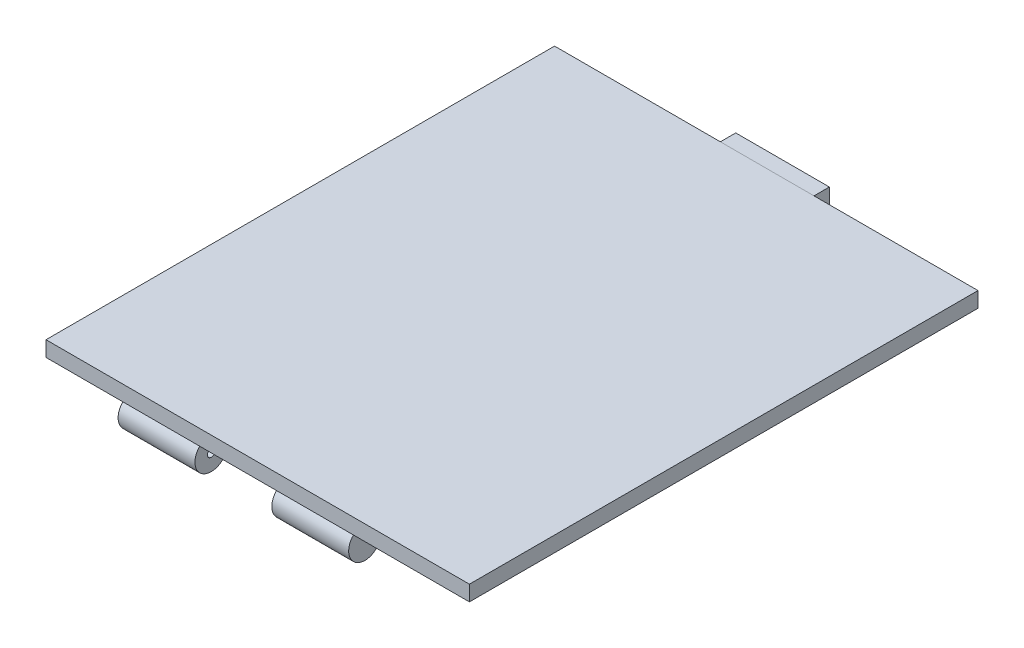
ISO-10303-21;
HEADER;
FILE_DESCRIPTION(('STEP AP214'),'2;1');
FILE_NAME('part.step','',(''),(''),'','','');
FILE_SCHEMA(('AUTOMOTIVE_DESIGN { 1 0 10303 214 1 1 1 1 }'));
ENDSEC;
DATA;
#1=APPLICATION_CONTEXT('core data for automotive mechanical design processes');
#2=APPLICATION_PROTOCOL_DEFINITION('international standard','automotive_design',2000,#1);
#3=PRODUCT_CONTEXT('',#1,'mechanical');
#4=PRODUCT('Part','Part','',(#3));
#5=PRODUCT_RELATED_PRODUCT_CATEGORY('part','',(#4));
#6=PRODUCT_DEFINITION_FORMATION('','',#4);
#7=PRODUCT_DEFINITION_CONTEXT('part definition',#1,'design');
#8=PRODUCT_DEFINITION('design','',#6,#7);
#9=PRODUCT_DEFINITION_SHAPE('','',#8);
#10=(LENGTH_UNIT() NAMED_UNIT(*) SI_UNIT(.MILLI.,.METRE.));
#11=(NAMED_UNIT(*) PLANE_ANGLE_UNIT() SI_UNIT($,.RADIAN.));
#12=(NAMED_UNIT(*) SI_UNIT($,.STERADIAN.) SOLID_ANGLE_UNIT());
#13=UNCERTAINTY_MEASURE_WITH_UNIT(LENGTH_MEASURE(1.E-05),#10,'distance_accuracy_value','');
#14=(GEOMETRIC_REPRESENTATION_CONTEXT(3) GLOBAL_UNCERTAINTY_ASSIGNED_CONTEXT((#13)) GLOBAL_UNIT_ASSIGNED_CONTEXT((#10,
#11,#12)) REPRESENTATION_CONTEXT('',''));
#15=CARTESIAN_POINT('',(0.,0.,0.));
#16=DIRECTION('',(0.,0.,1.));
#17=DIRECTION('',(1.,0.,0.));
#18=AXIS2_PLACEMENT_3D('',#15,#16,#17);
#19=CARTESIAN_POINT('',(0.,2.,-2.));
#20=DIRECTION('',(0.,-1.,0.));
#21=DIRECTION('',(0.,0.,-1.));
#22=AXIS2_PLACEMENT_3D('',#19,#20,#21);
#23=PLANE('',#22);
#24=DIRECTION('',(1.,0.,0.));
#25=VECTOR('',#24,1.);
#26=CARTESIAN_POINT('',(0.,2.,0.));
#27=LINE('',#26,#25);
#28=CARTESIAN_POINT('',(21.570158565403,2.,0.));
#29=VERTEX_POINT('',#28);
#30=CARTESIAN_POINT('',(33.7548871875866,2.,0.));
#31=VERTEX_POINT('',#30);
#32=EDGE_CURVE('E161',#29,#31,#27,.T.);
#33=ORIENTED_EDGE('',*,*,#32,.T.);
#34=DIRECTION('',(0.,0.,1.));
#35=VECTOR('',#34,1.);
#36=CARTESIAN_POINT('',(33.7548871875866,2.,-2.00000000000001));
#37=LINE('',#36,#35);
#38=CARTESIAN_POINT('',(33.7548871875866,2.,-2.00000000000001));
#39=VERTEX_POINT('',#38);
#40=EDGE_CURVE('E58',#39,#31,#37,.T.);
#41=ORIENTED_EDGE('',*,*,#40,.F.);
#42=DIRECTION('',(1.,0.,0.));
#43=VECTOR('',#42,1.);
#44=CARTESIAN_POINT('',(0.,2.,-2.));
#45=LINE('',#44,#43);
#46=CARTESIAN_POINT('',(21.570158565403,2.,-2.00000000000001));
#47=VERTEX_POINT('',#46);
#48=EDGE_CURVE('E140',#47,#39,#45,.T.);
#49=ORIENTED_EDGE('',*,*,#48,.F.);
#50=DIRECTION('',(0.,0.,1.));
#51=VECTOR('',#50,1.);
#52=CARTESIAN_POINT('',(21.570158565403,2.,-2.00000000000001));
#53=LINE('',#52,#51);
#54=EDGE_CURVE('E73',#47,#29,#53,.T.);
#55=ORIENTED_EDGE('',*,*,#54,.T.);
#56=EDGE_LOOP('',(#33,#41,#49,#55));
#57=FACE_BOUND('',#56,.T.);
#58=ADVANCED_FACE('F50',(#57),#23,.F.);
#59=CARTESIAN_POINT('',(33.7548871875866,0.,-2.00000000000001));
#60=DIRECTION('',(1.,0.,0.));
#61=DIRECTION('',(0.,0.,-1.));
#62=AXIS2_PLACEMENT_3D('',#59,#60,#61);
#63=PLANE('',#62);
#64=DIRECTION('',(0.,0.348047068519465,0.937477060036675));
#65=VECTOR('',#64,1.);
#66=CARTESIAN_POINT('',(33.7548871875866,-5.72819739649923,0.126646503408183));
#67=LINE('',#66,#65);
#68=CARTESIAN_POINT('',(33.7548871875866,-6.51773466929334,-2.00000000000001));
#69=VERTEX_POINT('',#68);
#70=CARTESIAN_POINT('',(33.7548871875866,-5.77521608754618,0.));
#71=VERTEX_POINT('',#70);
#72=EDGE_CURVE('E65',#69,#71,#67,.T.);
#73=ORIENTED_EDGE('',*,*,#72,.F.);
#74=DIRECTION('',(0.,1.,0.));
#75=VECTOR('',#74,1.);
#76=CARTESIAN_POINT('',(33.7548871875866,0.,-2.00000000000001));
#77=LINE('',#76,#75);
#78=EDGE_CURVE('E142',#69,#39,#77,.T.);
#79=ORIENTED_EDGE('',*,*,#78,.T.);
#80=ORIENTED_EDGE('',*,*,#40,.T.);
#81=DIRECTION('',(0.,1.,0.));
#82=VECTOR('',#81,1.);
#83=CARTESIAN_POINT('',(33.7548871875866,0.,0.));
#84=LINE('',#83,#82);
#85=EDGE_CURVE('E163',#71,#31,#84,.T.);
#86=ORIENTED_EDGE('',*,*,#85,.F.);
#87=EDGE_LOOP('',(#73,#79,#80,#86));
#88=FACE_BOUND('',#87,.T.);
#89=ADVANCED_FACE('F191',(#88),#63,.T.);
#90=CARTESIAN_POINT('',(32.5665912020275,0.,-2.00000000000001));
#91=DIRECTION('',(-1.,0.,0.));
#92=DIRECTION('',(0.,0.,1.));
#93=AXIS2_PLACEMENT_3D('',#90,#91,#92);
#94=PLANE('',#93);
#95=DIRECTION('',(0.,-1.,0.));
#96=VECTOR('',#95,1.);
#97=CARTESIAN_POINT('',(32.5665912020275,0.,0.));
#98=LINE('',#97,#96);
#99=CARTESIAN_POINT('',(32.5665912020275,-4.5,0.));
#100=VERTEX_POINT('',#99);
#101=CARTESIAN_POINT('',(32.5665912020275,-5.49325838084499,0.));
#102=VERTEX_POINT('',#101);
#103=EDGE_CURVE('E152',#100,#102,#98,.T.);
#104=ORIENTED_EDGE('',*,*,#103,.F.);
#105=DIRECTION('',(0.,0.,1.));
#106=VECTOR('',#105,1.);
#107=CARTESIAN_POINT('',(32.5665912020275,-4.5,-2.00000000000001));
#108=LINE('',#107,#106);
#109=CARTESIAN_POINT('',(32.5665912020275,-4.5,-2.00000000000001));
#110=VERTEX_POINT('',#109);
#111=EDGE_CURVE('E106',#110,#100,#108,.T.);
#112=ORIENTED_EDGE('',*,*,#111,.F.);
#113=DIRECTION('',(0.,-1.,0.));
#114=VECTOR('',#113,1.);
#115=CARTESIAN_POINT('',(32.5665912020275,0.,-2.00000000000001));
#116=LINE('',#115,#114);
#117=CARTESIAN_POINT('',(32.5665912020275,-5.49325838084499,-2.00000000000001));
#118=VERTEX_POINT('',#117);
#119=EDGE_CURVE('E130',#110,#118,#116,.T.);
#120=ORIENTED_EDGE('',*,*,#119,.T.);
#121=DIRECTION('',(0.,0.,1.));
#122=VECTOR('',#121,1.);
#123=CARTESIAN_POINT('',(32.5665912020275,-5.49325838084499,-2.00000000000001));
#124=LINE('',#123,#122);
#125=EDGE_CURVE('E119',#118,#102,#124,.T.);
#126=ORIENTED_EDGE('',*,*,#125,.T.);
#127=EDGE_LOOP('',(#104,#112,#120,#126));
#128=FACE_BOUND('',#127,.T.);
#129=ADVANCED_FACE('F52',(#128),#94,.T.);
#130=CARTESIAN_POINT('',(0.,-4.5,-2.));
#131=DIRECTION('',(0.,1.,0.));
#132=DIRECTION('',(0.,0.,1.));
#133=AXIS2_PLACEMENT_3D('',#130,#131,#132);
#134=PLANE('',#133);
#135=DIRECTION('',(-1.,0.,0.));
#136=VECTOR('',#135,1.);
#137=CARTESIAN_POINT('',(0.,-4.5,0.));
#138=LINE('',#137,#136);
#139=CARTESIAN_POINT('',(22.591665817738,-4.5,0.));
#140=VERTEX_POINT('',#139);
#141=EDGE_CURVE('E154',#100,#140,#138,.T.);
#142=ORIENTED_EDGE('',*,*,#141,.T.);
#143=DIRECTION('',(0.,0.,1.));
#144=VECTOR('',#143,1.);
#145=CARTESIAN_POINT('',(22.591665817738,-4.5,-2.00000000000001));
#146=LINE('',#145,#144);
#147=CARTESIAN_POINT('',(22.591665817738,-4.5,-2.00000000000001));
#148=VERTEX_POINT('',#147);
#149=EDGE_CURVE('E171',#148,#140,#146,.T.);
#150=ORIENTED_EDGE('',*,*,#149,.F.);
#151=DIRECTION('',(-1.,0.,0.));
#152=VECTOR('',#151,1.);
#153=CARTESIAN_POINT('',(0.,-4.5,-2.));
#154=LINE('',#153,#152);
#155=EDGE_CURVE('E132',#110,#148,#154,.T.);
#156=ORIENTED_EDGE('',*,*,#155,.F.);
#157=ORIENTED_EDGE('',*,*,#111,.T.);
#158=EDGE_LOOP('',(#142,#150,#156,#157));
#159=FACE_BOUND('',#158,.T.);
#160=ADVANCED_FACE('F174',(#159),#134,.F.);
#161=CARTESIAN_POINT('',(22.591665817738,0.,-2.00000000000001));
#162=DIRECTION('',(1.,0.,0.));
#163=DIRECTION('',(0.,0.,-1.));
#164=AXIS2_PLACEMENT_3D('',#161,#162,#163);
#165=PLANE('',#164);
#166=DIRECTION('',(0.,1.,0.));
#167=VECTOR('',#166,1.);
#168=CARTESIAN_POINT('',(22.591665817738,0.,0.));
#169=LINE('',#168,#167);
#170=CARTESIAN_POINT('',(22.591665817738,-5.49325838084499,0.));
#171=VERTEX_POINT('',#170);
#172=EDGE_CURVE('E157',#171,#140,#169,.T.);
#173=ORIENTED_EDGE('',*,*,#172,.F.);
#174=DIRECTION('',(0.,0.,1.));
#175=VECTOR('',#174,1.);
#176=CARTESIAN_POINT('',(22.591665817738,-5.49325838084499,-2.00000000000001));
#177=LINE('',#176,#175);
#178=CARTESIAN_POINT('',(22.591665817738,-5.49325838084499,-2.00000000000001));
#179=VERTEX_POINT('',#178);
#180=EDGE_CURVE('E126',#179,#171,#177,.T.);
#181=ORIENTED_EDGE('',*,*,#180,.F.);
#182=DIRECTION('',(0.,1.,0.));
#183=VECTOR('',#182,1.);
#184=CARTESIAN_POINT('',(22.591665817738,0.,-2.00000000000001));
#185=LINE('',#184,#183);
#186=EDGE_CURVE('E139',#179,#148,#185,.T.);
#187=ORIENTED_EDGE('',*,*,#186,.T.);
#188=ORIENTED_EDGE('',*,*,#149,.T.);
#189=EDGE_LOOP('',(#173,#181,#187,#188));
#190=FACE_BOUND('',#189,.T.);
#191=ADVANCED_FACE('F181',(#190),#165,.T.);
#192=CARTESIAN_POINT('',(0.,-5.49325838084499,-2.));
#193=DIRECTION('',(0.,1.,0.));
#194=DIRECTION('',(0.,0.,1.));
#195=AXIS2_PLACEMENT_3D('',#192,#193,#194);
#196=PLANE('',#195);
#197=DIRECTION('',(-1.,0.,0.));
#198=VECTOR('',#197,1.);
#199=CARTESIAN_POINT('',(0.,-5.49325838084499,0.));
#200=LINE('',#199,#198);
#201=EDGE_CURVE('E124',#102,#171,#200,.T.);
#202=ORIENTED_EDGE('',*,*,#201,.F.);
#203=ORIENTED_EDGE('',*,*,#125,.F.);
#204=DIRECTION('',(-1.,0.,0.));
#205=VECTOR('',#204,1.);
#206=CARTESIAN_POINT('',(0.,-5.49325838084499,-2.));
#207=LINE('',#206,#205);
#208=EDGE_CURVE('E122',#118,#179,#207,.T.);
#209=ORIENTED_EDGE('',*,*,#208,.T.);
#210=ORIENTED_EDGE('',*,*,#180,.T.);
#211=EDGE_LOOP('',(#202,#203,#209,#210));
#212=FACE_BOUND('',#211,.T.);
#213=ADVANCED_FACE('F120',(#212),#196,.T.);
#214=CARTESIAN_POINT('',(21.570158565403,0.,-2.00000000000001));
#215=DIRECTION('',(-1.,0.,0.));
#216=DIRECTION('',(0.,0.,1.));
#217=AXIS2_PLACEMENT_3D('',#214,#215,#216);
#218=PLANE('',#217);
#219=DIRECTION('',(0.,-0.348047068519465,-0.937477060036675));
#220=VECTOR('',#219,1.);
#221=CARTESIAN_POINT('',(21.570158565403,-5.72819739649923,0.126646503408187));
#222=LINE('',#221,#220);
#223=CARTESIAN_POINT('',(21.570158565403,-5.77521608754618,0.));
#224=VERTEX_POINT('',#223);
#225=CARTESIAN_POINT('',(21.570158565403,-6.51773466929334,-2.00000000000001));
#226=VERTEX_POINT('',#225);
#227=EDGE_CURVE('E302',#224,#226,#222,.T.);
#228=ORIENTED_EDGE('',*,*,#227,.F.);
#229=DIRECTION('',(0.,-1.,0.));
#230=VECTOR('',#229,1.);
#231=CARTESIAN_POINT('',(21.570158565403,0.,0.));
#232=LINE('',#231,#230);
#233=EDGE_CURVE('E133',#29,#224,#232,.T.);
#234=ORIENTED_EDGE('',*,*,#233,.F.);
#235=ORIENTED_EDGE('',*,*,#54,.F.);
#236=DIRECTION('',(0.,-1.,0.));
#237=VECTOR('',#236,1.);
#238=CARTESIAN_POINT('',(21.570158565403,0.,-2.00000000000001));
#239=LINE('',#238,#237);
#240=EDGE_CURVE('E127',#47,#226,#239,.T.);
#241=ORIENTED_EDGE('',*,*,#240,.T.);
#242=EDGE_LOOP('',(#228,#234,#235,#241));
#243=FACE_BOUND('',#242,.T.);
#244=ADVANCED_FACE('F188',(#243),#218,.T.);
#245=CARTESIAN_POINT('',(0.,0.,-2.));
#246=DIRECTION('',(0.,0.,-1.));
#247=DIRECTION('',(-1.,0.,0.));
#248=AXIS2_PLACEMENT_3D('',#245,#246,#247);
#249=PLANE('',#248);
#250=ORIENTED_EDGE('',*,*,#119,.F.);
#251=ORIENTED_EDGE('',*,*,#155,.T.);
#252=ORIENTED_EDGE('',*,*,#186,.F.);
#253=ORIENTED_EDGE('',*,*,#208,.F.);
#254=EDGE_LOOP('',(#250,#251,#252,#253));
#255=FACE_BOUND('',#254,.T.);
#256=ORIENTED_EDGE('',*,*,#48,.T.);
#257=ORIENTED_EDGE('',*,*,#78,.F.);
#258=DIRECTION('',(1.,0.,0.));
#259=VECTOR('',#258,1.);
#260=CARTESIAN_POINT('',(0.,-6.51773466929334,-2.));
#261=LINE('',#260,#259);
#262=EDGE_CURVE('E149',#226,#69,#261,.T.);
#263=ORIENTED_EDGE('',*,*,#262,.F.);
#264=ORIENTED_EDGE('',*,*,#240,.F.);
#265=EDGE_LOOP('',(#256,#257,#263,#264));
#266=FACE_BOUND('',#265,.T.);
#267=ADVANCED_FACE('F136',(#255,#266),#249,.T.);
#268=CARTESIAN_POINT('',(0.,0.,0.));
#269=DIRECTION('',(0.,0.,-1.));
#270=DIRECTION('',(-1.,0.,0.));
#271=AXIS2_PLACEMENT_3D('',#268,#269,#270);
#272=PLANE('',#271);
#273=ORIENTED_EDGE('',*,*,#103,.T.);
#274=ORIENTED_EDGE('',*,*,#201,.T.);
#275=ORIENTED_EDGE('',*,*,#172,.T.);
#276=ORIENTED_EDGE('',*,*,#141,.F.);
#277=EDGE_LOOP('',(#273,#274,#275,#276));
#278=FACE_BOUND('',#277,.T.);
#279=ORIENTED_EDGE('',*,*,#233,.T.);
#280=DIRECTION('',(1.,0.,0.));
#281=VECTOR('',#280,1.);
#282=CARTESIAN_POINT('',(0.,-5.77521608754618,0.));
#283=LINE('',#282,#281);
#284=EDGE_CURVE('E12',#224,#71,#283,.T.);
#285=ORIENTED_EDGE('',*,*,#284,.T.);
#286=ORIENTED_EDGE('',*,*,#85,.T.);
#287=ORIENTED_EDGE('',*,*,#32,.F.);
#288=EDGE_LOOP('',(#279,#285,#286,#287));
#289=FACE_BOUND('',#288,.T.);
#290=ADVANCED_FACE('F177',(#278,#289),#272,.F.);
#291=CARTESIAN_POINT('',(55.09,-6.51773466929334,-2.00000000000002));
#292=DIRECTION('',(0.,0.937477060036675,-0.348047068519465));
#293=DIRECTION('',(0.,0.348047068519465,0.937477060036675));
#294=AXIS2_PLACEMENT_3D('',#291,#292,#293);
#295=PLANE('',#294);
#296=ORIENTED_EDGE('',*,*,#72,.T.);
#297=ORIENTED_EDGE('',*,*,#284,.F.);
#298=ORIENTED_EDGE('',*,*,#227,.T.);
#299=ORIENTED_EDGE('',*,*,#262,.T.);
#300=EDGE_LOOP('',(#296,#297,#298,#299));
#301=FACE_BOUND('',#300,.T.);
#302=ADVANCED_FACE('F204',(#301),#295,.F.);
#303=CLOSED_SHELL('',(#58,#89,#129,#160,#191,#213,#244,#267,#290,#302));
#304=MANIFOLD_SOLID_BREP('B2',#303);
#305=CARTESIAN_POINT('',(0.,0.,0.));
#306=DIRECTION('',(0.,-1.,0.));
#307=DIRECTION('',(0.,0.,-1.));
#308=AXIS2_PLACEMENT_3D('',#305,#306,#307);
#309=PLANE('',#308);
#310=DIRECTION('',(1.,0.,0.));
#311=VECTOR('',#310,1.);
#312=CARTESIAN_POINT('',(0.,0.,66.17));
#313=LINE('',#312,#311);
#314=CARTESIAN_POINT('',(40.,0.,66.17));
#315=VERTEX_POINT('',#314);
#316=CARTESIAN_POINT('',(55.09,0.,66.17));
#317=VERTEX_POINT('',#316);
#318=EDGE_CURVE('E385',#315,#317,#313,.T.);
#319=ORIENTED_EDGE('',*,*,#318,.F.);
#320=DIRECTION('',(0.,0.,-1.));
#321=VECTOR('',#320,1.);
#322=CARTESIAN_POINT('',(40.,0.,0.));
#323=LINE('',#322,#321);
#324=CARTESIAN_POINT('',(40.,0.,63.17));
#325=VERTEX_POINT('',#324);
#326=EDGE_CURVE('E396',#315,#325,#323,.T.);
#327=ORIENTED_EDGE('',*,*,#326,.T.);
#328=DIRECTION('',(-1.,0.,0.));
#329=VECTOR('',#328,1.);
#330=CARTESIAN_POINT('',(40.,0.,63.17));
#331=LINE('',#330,#329);
#332=CARTESIAN_POINT('',(30.,0.,63.17));
#333=VERTEX_POINT('',#332);
#334=EDGE_CURVE('E395',#333,#325,#331,.F.);
#335=ORIENTED_EDGE('',*,*,#334,.F.);
#336=DIRECTION('',(0.,0.,-1.));
#337=VECTOR('',#336,1.);
#338=CARTESIAN_POINT('',(30.,0.,0.));
#339=LINE('',#338,#337);
#340=CARTESIAN_POINT('',(30.,0.,66.17));
#341=VERTEX_POINT('',#340);
#342=EDGE_CURVE('E390',#341,#333,#339,.T.);
#343=ORIENTED_EDGE('',*,*,#342,.F.);
#344=CARTESIAN_POINT('',(20.,0.,66.17));
#345=VERTEX_POINT('',#344);
#346=EDGE_CURVE('E384',#345,#341,#313,.T.);
#347=ORIENTED_EDGE('',*,*,#346,.F.);
#348=DIRECTION('',(0.,0.,-1.));
#349=VECTOR('',#348,1.);
#350=CARTESIAN_POINT('',(20.,0.,0.));
#351=LINE('',#350,#349);
#352=CARTESIAN_POINT('',(20.,0.,63.17));
#353=VERTEX_POINT('',#352);
#354=EDGE_CURVE('E48',#345,#353,#351,.T.);
#355=ORIENTED_EDGE('',*,*,#354,.T.);
#356=DIRECTION('',(-1.,0.,0.));
#357=VECTOR('',#356,1.);
#358=CARTESIAN_POINT('',(20.,0.,63.17));
#359=LINE('',#358,#357);
#360=CARTESIAN_POINT('',(10.,0.,63.17));
#361=VERTEX_POINT('',#360);
#362=EDGE_CURVE('E323',#361,#353,#359,.F.);
#363=ORIENTED_EDGE('',*,*,#362,.F.);
#364=DIRECTION('',(0.,0.,-1.));
#365=VECTOR('',#364,1.);
#366=CARTESIAN_POINT('',(10.,0.,0.));
#367=LINE('',#366,#365);
#368=CARTESIAN_POINT('',(10.,0.,66.17));
#369=VERTEX_POINT('',#368);
#370=EDGE_CURVE('E423',#369,#361,#367,.T.);
#371=ORIENTED_EDGE('',*,*,#370,.F.);
#372=CARTESIAN_POINT('',(0.,0.,66.17));
#373=VERTEX_POINT('',#372);
#374=EDGE_CURVE('E402',#373,#369,#313,.T.);
#375=ORIENTED_EDGE('',*,*,#374,.F.);
#376=DIRECTION('',(0.,0.,1.));
#377=VECTOR('',#376,1.);
#378=CARTESIAN_POINT('',(0.,0.,0.));
#379=LINE('',#378,#377);
#380=CARTESIAN_POINT('',(0.,0.,0.));
#381=VERTEX_POINT('',#380);
#382=EDGE_CURVE('E406',#381,#373,#379,.T.);
#383=ORIENTED_EDGE('',*,*,#382,.F.);
#384=DIRECTION('',(-1.,0.,0.));
#385=VECTOR('',#384,1.);
#386=CARTESIAN_POINT('',(0.,0.,0.));
#387=LINE('',#386,#385);
#388=CARTESIAN_POINT('',(55.09,0.,0.));
#389=VERTEX_POINT('',#388);
#390=EDGE_CURVE('E436',#389,#381,#387,.T.);
#391=ORIENTED_EDGE('',*,*,#390,.F.);
#392=DIRECTION('',(0.,0.,-1.));
#393=VECTOR('',#392,1.);
#394=CARTESIAN_POINT('',(55.09,0.,0.));
#395=LINE('',#394,#393);
#396=EDGE_CURVE('E405',#317,#389,#395,.T.);
#397=ORIENTED_EDGE('',*,*,#396,.F.);
#398=EDGE_LOOP('',(#319,#327,#335,#343,#347,#355,#363,#371,#375,#383,#391,#397));
#399=FACE_BOUND('',#398,.T.);
#400=ADVANCED_FACE('F315',(#399),#309,.T.);
#401=CARTESIAN_POINT('',(0.,2.,0.));
#402=DIRECTION('',(0.,0.,1.));
#403=DIRECTION('',(1.,0.,0.));
#404=AXIS2_PLACEMENT_3D('',#401,#402,#403);
#405=PLANE('',#404);
#406=ORIENTED_EDGE('',*,*,#390,.T.);
#407=DIRECTION('',(0.,-1.,0.));
#408=VECTOR('',#407,1.);
#409=CARTESIAN_POINT('',(0.,2.,0.));
#410=LINE('',#409,#408);
#411=CARTESIAN_POINT('',(0.,2.,0.));
#412=VERTEX_POINT('',#411);
#413=EDGE_CURVE('E420',#412,#381,#410,.T.);
#414=ORIENTED_EDGE('',*,*,#413,.F.);
#415=DIRECTION('',(-1.,0.,0.));
#416=VECTOR('',#415,1.);
#417=CARTESIAN_POINT('',(0.,2.,0.));
#418=LINE('',#417,#416);
#419=CARTESIAN_POINT('',(55.09,2.,0.));
#420=VERTEX_POINT('',#419);
#421=EDGE_CURVE('E409',#420,#412,#418,.T.);
#422=ORIENTED_EDGE('',*,*,#421,.F.);
#423=DIRECTION('',(0.,-1.,0.));
#424=VECTOR('',#423,1.);
#425=CARTESIAN_POINT('',(55.09,2.,0.));
#426=LINE('',#425,#424);
#427=EDGE_CURVE('E410',#420,#389,#426,.T.);
#428=ORIENTED_EDGE('',*,*,#427,.T.);
#429=EDGE_LOOP('',(#406,#414,#422,#428));
#430=FACE_BOUND('',#429,.T.);
#431=ADVANCED_FACE('F317',(#430),#405,.F.);
#432=CARTESIAN_POINT('',(0.,2.,0.));
#433=DIRECTION('',(1.,0.,0.));
#434=DIRECTION('',(0.,0.,-1.));
#435=AXIS2_PLACEMENT_3D('',#432,#433,#434);
#436=PLANE('',#435);
#437=ORIENTED_EDGE('',*,*,#382,.T.);
#438=DIRECTION('',(0.,-1.,0.));
#439=VECTOR('',#438,1.);
#440=CARTESIAN_POINT('',(0.,2.,66.17));
#441=LINE('',#440,#439);
#442=CARTESIAN_POINT('',(0.,2.,66.17));
#443=VERTEX_POINT('',#442);
#444=EDGE_CURVE('E417',#443,#373,#441,.T.);
#445=ORIENTED_EDGE('',*,*,#444,.F.);
#446=DIRECTION('',(0.,0.,1.));
#447=VECTOR('',#446,1.);
#448=CARTESIAN_POINT('',(0.,2.,0.));
#449=LINE('',#448,#447);
#450=EDGE_CURVE('E450',#412,#443,#449,.T.);
#451=ORIENTED_EDGE('',*,*,#450,.F.);
#452=ORIENTED_EDGE('',*,*,#413,.T.);
#453=EDGE_LOOP('',(#437,#445,#451,#452));
#454=FACE_BOUND('',#453,.T.);
#455=ADVANCED_FACE('F468',(#454),#436,.F.);
#456=CARTESIAN_POINT('',(0.,2.,66.17));
#457=DIRECTION('',(0.,0.,-1.));
#458=DIRECTION('',(-1.,0.,0.));
#459=AXIS2_PLACEMENT_3D('',#456,#457,#458);
#460=PLANE('',#459);
#461=ORIENTED_EDGE('',*,*,#374,.T.);
#462=EDGE_CURVE('E401',#369,#345,#313,.T.);
#463=ORIENTED_EDGE('',*,*,#462,.T.);
#464=ORIENTED_EDGE('',*,*,#346,.T.);
#465=EDGE_CURVE('E377',#341,#315,#313,.T.);
#466=ORIENTED_EDGE('',*,*,#465,.T.);
#467=ORIENTED_EDGE('',*,*,#318,.T.);
#468=DIRECTION('',(0.,-1.,0.));
#469=VECTOR('',#468,1.);
#470=CARTESIAN_POINT('',(55.09,2.,66.17));
#471=LINE('',#470,#469);
#472=CARTESIAN_POINT('',(55.09,2.,66.17));
#473=VERTEX_POINT('',#472);
#474=EDGE_CURVE('E413',#473,#317,#471,.T.);
#475=ORIENTED_EDGE('',*,*,#474,.F.);
#476=DIRECTION('',(1.,0.,0.));
#477=VECTOR('',#476,1.);
#478=CARTESIAN_POINT('',(0.,2.,66.17));
#479=LINE('',#478,#477);
#480=EDGE_CURVE('E452',#443,#473,#479,.T.);
#481=ORIENTED_EDGE('',*,*,#480,.F.);
#482=ORIENTED_EDGE('',*,*,#444,.T.);
#483=EDGE_LOOP('',(#461,#463,#464,#466,#467,#475,#481,#482));
#484=FACE_BOUND('',#483,.T.);
#485=ADVANCED_FACE('F399',(#484),#460,.F.);
#486=CARTESIAN_POINT('',(55.09,2.,0.));
#487=DIRECTION('',(-1.,0.,0.));
#488=DIRECTION('',(0.,0.,1.));
#489=AXIS2_PLACEMENT_3D('',#486,#487,#488);
#490=PLANE('',#489);
#491=ORIENTED_EDGE('',*,*,#396,.T.);
#492=ORIENTED_EDGE('',*,*,#427,.F.);
#493=DIRECTION('',(0.,0.,-1.));
#494=VECTOR('',#493,1.);
#495=CARTESIAN_POINT('',(55.09,2.,0.));
#496=LINE('',#495,#494);
#497=EDGE_CURVE('E414',#473,#420,#496,.T.);
#498=ORIENTED_EDGE('',*,*,#497,.F.);
#499=ORIENTED_EDGE('',*,*,#474,.T.);
#500=EDGE_LOOP('',(#491,#492,#498,#499));
#501=FACE_BOUND('',#500,.T.);
#502=ADVANCED_FACE('F463',(#501),#490,.F.);
#503=CARTESIAN_POINT('',(0.,2.,0.));
#504=DIRECTION('',(0.,-1.,0.));
#505=DIRECTION('',(0.,0.,-1.));
#506=AXIS2_PLACEMENT_3D('',#503,#504,#505);
#507=PLANE('',#506);
#508=ORIENTED_EDGE('',*,*,#421,.T.);
#509=ORIENTED_EDGE('',*,*,#450,.T.);
#510=ORIENTED_EDGE('',*,*,#480,.T.);
#511=ORIENTED_EDGE('',*,*,#497,.T.);
#512=EDGE_LOOP('',(#508,#509,#510,#511));
#513=FACE_BOUND('',#512,.T.);
#514=ADVANCED_FACE('F457',(#513),#507,.F.);
#515=CARTESIAN_POINT('',(20.,-1.5,64.67));
#516=DIRECTION('',(-1.,0.,0.));
#517=DIRECTION('',(0.,0.,1.));
#518=AXIS2_PLACEMENT_3D('',#515,#516,#517);
#519=CYLINDRICAL_SURFACE('',#518,0.499999999999999);
#520=CARTESIAN_POINT('',(20.,-1.5,64.67));
#521=DIRECTION('',(-1.,0.,0.));
#522=DIRECTION('',(0.,0.,1.));
#523=AXIS2_PLACEMENT_3D('',#520,#521,#522);
#524=CIRCLE('',#523,0.499999999999999);
#525=CARTESIAN_POINT('',(20.,-1.5,65.17));
#526=VERTEX_POINT('',#525);
#527=EDGE_CURVE('E437',#526,#526,#524,.T.);
#528=ORIENTED_EDGE('',*,*,#527,.F.);
#529=EDGE_LOOP('',(#528));
#530=FACE_BOUND('',#529,.T.);
#531=CARTESIAN_POINT('',(10.,-1.5,64.67));
#532=DIRECTION('',(-1.,0.,0.));
#533=DIRECTION('',(0.,0.,1.));
#534=AXIS2_PLACEMENT_3D('',#531,#532,#533);
#535=CIRCLE('',#534,0.499999999999999);
#536=CARTESIAN_POINT('',(10.,-1.5,65.17));
#537=VERTEX_POINT('',#536);
#538=EDGE_CURVE('E444',#537,#537,#535,.T.);
#539=ORIENTED_EDGE('',*,*,#538,.T.);
#540=EDGE_LOOP('',(#539));
#541=FACE_BOUND('',#540,.T.);
#542=ADVANCED_FACE('F516',(#530,#541),#519,.F.);
#543=CARTESIAN_POINT('',(20.,-1.5,64.67));
#544=DIRECTION('',(-1.,0.,0.));
#545=DIRECTION('',(0.,0.,1.));
#546=AXIS2_PLACEMENT_3D('',#543,#544,#545);
#547=CYLINDRICAL_SURFACE('',#546,2.12132034355964);
#548=CARTESIAN_POINT('',(20.,-1.5,64.67));
#549=DIRECTION('',(-1.,0.,0.));
#550=DIRECTION('',(0.,0.,1.));
#551=AXIS2_PLACEMENT_3D('',#548,#549,#550);
#552=CIRCLE('',#551,2.12132034355964);
#553=EDGE_CURVE('E430',#353,#345,#552,.T.);
#554=ORIENTED_EDGE('',*,*,#553,.T.);
#555=ORIENTED_EDGE('',*,*,#462,.F.);
#556=CARTESIAN_POINT('',(10.,-1.5,64.67));
#557=DIRECTION('',(-1.,0.,0.));
#558=DIRECTION('',(0.,0.,1.));
#559=AXIS2_PLACEMENT_3D('',#556,#557,#558);
#560=CIRCLE('',#559,2.12132034355964);
#561=EDGE_CURVE('E432',#361,#369,#560,.T.);
#562=ORIENTED_EDGE('',*,*,#561,.F.);
#563=ORIENTED_EDGE('',*,*,#362,.T.);
#564=EDGE_LOOP('',(#554,#555,#562,#563));
#565=FACE_BOUND('',#564,.T.);
#566=ADVANCED_FACE('F429',(#565),#547,.T.);
#567=CARTESIAN_POINT('',(20.,0.,0.));
#568=DIRECTION('',(-1.,0.,0.));
#569=DIRECTION('',(0.,0.,1.));
#570=AXIS2_PLACEMENT_3D('',#567,#568,#569);
#571=PLANE('',#570);
#572=ORIENTED_EDGE('',*,*,#354,.F.);
#573=ORIENTED_EDGE('',*,*,#553,.F.);
#574=EDGE_LOOP('',(#572,#573));
#575=FACE_BOUND('',#574,.T.);
#576=ORIENTED_EDGE('',*,*,#527,.T.);
#577=EDGE_LOOP('',(#576));
#578=FACE_BOUND('',#577,.T.);
#579=ADVANCED_FACE('F434',(#575,#578),#571,.F.);
#580=CARTESIAN_POINT('',(10.,0.,0.));
#581=DIRECTION('',(-1.,0.,0.));
#582=DIRECTION('',(0.,0.,1.));
#583=AXIS2_PLACEMENT_3D('',#580,#581,#582);
#584=PLANE('',#583);
#585=ORIENTED_EDGE('',*,*,#538,.F.);
#586=EDGE_LOOP('',(#585));
#587=FACE_BOUND('',#586,.T.);
#588=ORIENTED_EDGE('',*,*,#561,.T.);
#589=ORIENTED_EDGE('',*,*,#370,.T.);
#590=EDGE_LOOP('',(#588,#589));
#591=FACE_BOUND('',#590,.T.);
#592=ADVANCED_FACE('F472',(#587,#591),#584,.T.);
#593=CARTESIAN_POINT('',(40.,-1.5,64.67));
#594=DIRECTION('',(-1.,0.,0.));
#595=DIRECTION('',(0.,0.,1.));
#596=AXIS2_PLACEMENT_3D('',#593,#594,#595);
#597=CYLINDRICAL_SURFACE('',#596,2.12132034355965);
#598=CARTESIAN_POINT('',(30.,-1.5,64.67));
#599=DIRECTION('',(-1.,0.,0.));
#600=DIRECTION('',(0.,0.,1.));
#601=AXIS2_PLACEMENT_3D('',#598,#599,#600);
#602=CIRCLE('',#601,2.12132034355965);
#603=EDGE_CURVE('E380',#333,#341,#602,.T.);
#604=ORIENTED_EDGE('',*,*,#603,.F.);
#605=ORIENTED_EDGE('',*,*,#334,.T.);
#606=CARTESIAN_POINT('',(40.,-1.5,64.67));
#607=DIRECTION('',(-1.,0.,0.));
#608=DIRECTION('',(0.,0.,1.));
#609=AXIS2_PLACEMENT_3D('',#606,#607,#608);
#610=CIRCLE('',#609,2.12132034355965);
#611=EDGE_CURVE('E330',#325,#315,#610,.T.);
#612=ORIENTED_EDGE('',*,*,#611,.T.);
#613=ORIENTED_EDGE('',*,*,#465,.F.);
#614=EDGE_LOOP('',(#604,#605,#612,#613));
#615=FACE_BOUND('',#614,.T.);
#616=ADVANCED_FACE('F379',(#615),#597,.T.);
#617=CARTESIAN_POINT('',(40.,-1.5,64.67));
#618=DIRECTION('',(-1.,0.,0.));
#619=DIRECTION('',(0.,0.,1.));
#620=AXIS2_PLACEMENT_3D('',#617,#618,#619);
#621=PLANE('',#620);
#622=ORIENTED_EDGE('',*,*,#326,.F.);
#623=ORIENTED_EDGE('',*,*,#611,.F.);
#624=EDGE_LOOP('',(#622,#623));
#625=FACE_BOUND('',#624,.T.);
#626=ADVANCED_FACE('F480',(#625),#621,.F.);
#627=CARTESIAN_POINT('',(30.,-1.5,64.67));
#628=DIRECTION('',(-1.,0.,0.));
#629=DIRECTION('',(0.,0.,1.));
#630=AXIS2_PLACEMENT_3D('',#627,#628,#629);
#631=PLANE('',#630);
#632=ORIENTED_EDGE('',*,*,#603,.T.);
#633=ORIENTED_EDGE('',*,*,#342,.T.);
#634=EDGE_LOOP('',(#632,#633));
#635=FACE_BOUND('',#634,.T.);
#636=ADVANCED_FACE('F389',(#635),#631,.T.);
#637=CLOSED_SHELL('',(#400,#431,#455,#485,#502,#514,#542,#566,#579,#592,#616,#626,#636));
#638=MANIFOLD_SOLID_BREP('B6',#637);
#639=ADVANCED_BREP_SHAPE_REPRESENTATION('',(#18,#304,#638),#14);
#640=SHAPE_DEFINITION_REPRESENTATION(#9,#639);
ENDSEC;
END-ISO-10303-21;
